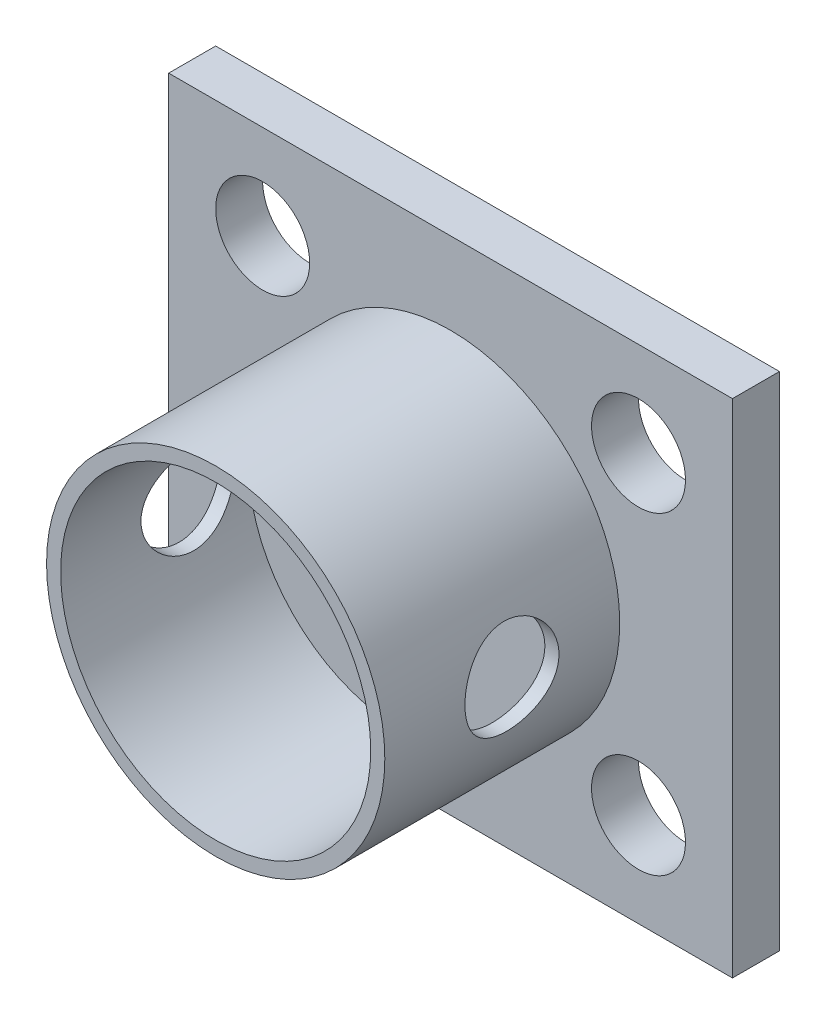
ISO-10303-21;
HEADER;
FILE_DESCRIPTION(('STEP AP214'),'2;1');
FILE_NAME('part.step','',(''),(''),'','','');
FILE_SCHEMA(('AUTOMOTIVE_DESIGN { 1 0 10303 214 1 1 1 1 }'));
ENDSEC;
DATA;
#1=APPLICATION_CONTEXT('core data for automotive mechanical design processes');
#2=APPLICATION_PROTOCOL_DEFINITION('international standard','automotive_design',2000,#1);
#3=PRODUCT_CONTEXT('',#1,'mechanical');
#4=PRODUCT('Part','Part','',(#3));
#5=PRODUCT_RELATED_PRODUCT_CATEGORY('part','',(#4));
#6=PRODUCT_DEFINITION_FORMATION('','',#4);
#7=PRODUCT_DEFINITION_CONTEXT('part definition',#1,'design');
#8=PRODUCT_DEFINITION('design','',#6,#7);
#9=PRODUCT_DEFINITION_SHAPE('','',#8);
#10=(LENGTH_UNIT() NAMED_UNIT(*) SI_UNIT(.MILLI.,.METRE.));
#11=(NAMED_UNIT(*) PLANE_ANGLE_UNIT() SI_UNIT($,.RADIAN.));
#12=(NAMED_UNIT(*) SI_UNIT($,.STERADIAN.) SOLID_ANGLE_UNIT());
#13=UNCERTAINTY_MEASURE_WITH_UNIT(LENGTH_MEASURE(1.E-05),#10,'distance_accuracy_value','');
#14=(GEOMETRIC_REPRESENTATION_CONTEXT(3) GLOBAL_UNCERTAINTY_ASSIGNED_CONTEXT((#13)) GLOBAL_UNIT_ASSIGNED_CONTEXT((#10,
#11,#12)) REPRESENTATION_CONTEXT('',''));
#15=CARTESIAN_POINT('',(0.,0.,0.));
#16=DIRECTION('',(0.,0.,1.));
#17=DIRECTION('',(1.,0.,0.));
#18=AXIS2_PLACEMENT_3D('',#15,#16,#17);
#19=CARTESIAN_POINT('',(30.,0.,5.));
#20=DIRECTION('',(1.,0.,0.));
#21=DIRECTION('',(0.,0.,-1.));
#22=AXIS2_PLACEMENT_3D('',#19,#20,#21);
#23=PLANE('',#22);
#24=DIRECTION('',(0.,-1.,0.));
#25=VECTOR('',#24,1.);
#26=CARTESIAN_POINT('',(30.,0.,0.));
#27=LINE('',#26,#25);
#28=CARTESIAN_POINT('',(30.,26.7,0.));
#29=VERTEX_POINT('',#28);
#30=CARTESIAN_POINT('',(30.,-26.7,0.));
#31=VERTEX_POINT('',#30);
#32=EDGE_CURVE('E140',#29,#31,#27,.T.);
#33=ORIENTED_EDGE('',*,*,#32,.F.);
#34=DIRECTION('',(0.,0.,-1.));
#35=VECTOR('',#34,1.);
#36=CARTESIAN_POINT('',(30.,26.7,5.));
#37=LINE('',#36,#35);
#38=CARTESIAN_POINT('',(30.,26.7,5.));
#39=VERTEX_POINT('',#38);
#40=EDGE_CURVE('E55',#39,#29,#37,.T.);
#41=ORIENTED_EDGE('',*,*,#40,.F.);
#42=DIRECTION('',(0.,-1.,0.));
#43=VECTOR('',#42,1.);
#44=CARTESIAN_POINT('',(30.,0.,5.));
#45=LINE('',#44,#43);
#46=CARTESIAN_POINT('',(30.,-26.7,5.));
#47=VERTEX_POINT('',#46);
#48=EDGE_CURVE('E113',#39,#47,#45,.T.);
#49=ORIENTED_EDGE('',*,*,#48,.T.);
#50=DIRECTION('',(0.,0.,-1.));
#51=VECTOR('',#50,1.);
#52=CARTESIAN_POINT('',(30.,-26.7,5.));
#53=LINE('',#52,#51);
#54=EDGE_CURVE('E88',#47,#31,#53,.T.);
#55=ORIENTED_EDGE('',*,*,#54,.T.);
#56=EDGE_LOOP('',(#33,#41,#49,#55));
#57=FACE_BOUND('',#56,.T.);
#58=ADVANCED_FACE('F39',(#57),#23,.T.);
#59=CARTESIAN_POINT('',(0.,26.7,5.));
#60=DIRECTION('',(0.,1.,0.));
#61=DIRECTION('',(0.,0.,1.));
#62=AXIS2_PLACEMENT_3D('',#59,#60,#61);
#63=PLANE('',#62);
#64=DIRECTION('',(1.,0.,0.));
#65=VECTOR('',#64,1.);
#66=CARTESIAN_POINT('',(0.,26.7,0.));
#67=LINE('',#66,#65);
#68=CARTESIAN_POINT('',(-30.,26.7,0.));
#69=VERTEX_POINT('',#68);
#70=EDGE_CURVE('E101',#69,#29,#67,.T.);
#71=ORIENTED_EDGE('',*,*,#70,.F.);
#72=DIRECTION('',(0.,0.,-1.));
#73=VECTOR('',#72,1.);
#74=CARTESIAN_POINT('',(-30.,26.7,5.));
#75=LINE('',#74,#73);
#76=CARTESIAN_POINT('',(-30.,26.7,5.));
#77=VERTEX_POINT('',#76);
#78=EDGE_CURVE('E95',#77,#69,#75,.T.);
#79=ORIENTED_EDGE('',*,*,#78,.F.);
#80=DIRECTION('',(1.,0.,0.));
#81=VECTOR('',#80,1.);
#82=CARTESIAN_POINT('',(0.,26.7,5.));
#83=LINE('',#82,#81);
#84=EDGE_CURVE('E99',#77,#39,#83,.T.);
#85=ORIENTED_EDGE('',*,*,#84,.T.);
#86=ORIENTED_EDGE('',*,*,#40,.T.);
#87=EDGE_LOOP('',(#71,#79,#85,#86));
#88=FACE_BOUND('',#87,.T.);
#89=ADVANCED_FACE('F97',(#88),#63,.T.);
#90=CARTESIAN_POINT('',(-30.,0.,5.));
#91=DIRECTION('',(1.,0.,0.));
#92=DIRECTION('',(0.,0.,-1.));
#93=AXIS2_PLACEMENT_3D('',#90,#91,#92);
#94=PLANE('',#93);
#95=DIRECTION('',(0.,-1.,0.));
#96=VECTOR('',#95,1.);
#97=CARTESIAN_POINT('',(-30.,0.,0.));
#98=LINE('',#97,#96);
#99=CARTESIAN_POINT('',(-30.,-26.7,0.));
#100=VERTEX_POINT('',#99);
#101=EDGE_CURVE('E145',#69,#100,#98,.T.);
#102=ORIENTED_EDGE('',*,*,#101,.T.);
#103=DIRECTION('',(0.,0.,-1.));
#104=VECTOR('',#103,1.);
#105=CARTESIAN_POINT('',(-30.,-26.7,5.));
#106=LINE('',#105,#104);
#107=CARTESIAN_POINT('',(-30.,-26.7,5.));
#108=VERTEX_POINT('',#107);
#109=EDGE_CURVE('E105',#108,#100,#106,.T.);
#110=ORIENTED_EDGE('',*,*,#109,.F.);
#111=DIRECTION('',(0.,-1.,0.));
#112=VECTOR('',#111,1.);
#113=CARTESIAN_POINT('',(-30.,0.,5.));
#114=LINE('',#113,#112);
#115=EDGE_CURVE('E108',#77,#108,#114,.T.);
#116=ORIENTED_EDGE('',*,*,#115,.F.);
#117=ORIENTED_EDGE('',*,*,#78,.T.);
#118=EDGE_LOOP('',(#102,#110,#116,#117));
#119=FACE_BOUND('',#118,.T.);
#120=ADVANCED_FACE('F109',(#119),#94,.F.);
#121=CARTESIAN_POINT('',(-20.,16.7,5.));
#122=DIRECTION('',(0.,0.,-1.));
#123=DIRECTION('',(-1.,0.,0.));
#124=AXIS2_PLACEMENT_3D('',#121,#122,#123);
#125=CYLINDRICAL_SURFACE('',#124,5.);
#126=CARTESIAN_POINT('',(-20.,16.7,5.));
#127=DIRECTION('',(0.,0.,1.));
#128=DIRECTION('',(1.,0.,0.));
#129=AXIS2_PLACEMENT_3D('',#126,#127,#128);
#130=CIRCLE('',#129,5.);
#131=CARTESIAN_POINT('',(-15.,16.7,5.));
#132=VERTEX_POINT('',#131);
#133=EDGE_CURVE('E272',#132,#132,#130,.T.);
#134=ORIENTED_EDGE('',*,*,#133,.T.);
#135=EDGE_LOOP('',(#134));
#136=FACE_BOUND('',#135,.T.);
#137=CARTESIAN_POINT('',(-20.,16.7,0.));
#138=DIRECTION('',(0.,0.,1.));
#139=DIRECTION('',(1.,0.,0.));
#140=AXIS2_PLACEMENT_3D('',#137,#138,#139);
#141=CIRCLE('',#140,5.);
#142=CARTESIAN_POINT('',(-15.,16.7,0.));
#143=VERTEX_POINT('',#142);
#144=EDGE_CURVE('E136',#143,#143,#141,.T.);
#145=ORIENTED_EDGE('',*,*,#144,.F.);
#146=EDGE_LOOP('',(#145));
#147=FACE_BOUND('',#146,.T.);
#148=ADVANCED_FACE('F209',(#136,#147),#125,.F.);
#149=CARTESIAN_POINT('',(20.,16.7,5.));
#150=DIRECTION('',(0.,0.,-1.));
#151=DIRECTION('',(-1.,0.,0.));
#152=AXIS2_PLACEMENT_3D('',#149,#150,#151);
#153=CYLINDRICAL_SURFACE('',#152,5.);
#154=CARTESIAN_POINT('',(20.,16.7,5.));
#155=DIRECTION('',(0.,0.,1.));
#156=DIRECTION('',(1.,0.,0.));
#157=AXIS2_PLACEMENT_3D('',#154,#155,#156);
#158=CIRCLE('',#157,5.);
#159=CARTESIAN_POINT('',(25.,16.7,5.));
#160=VERTEX_POINT('',#159);
#161=EDGE_CURVE('E268',#160,#160,#158,.T.);
#162=ORIENTED_EDGE('',*,*,#161,.T.);
#163=EDGE_LOOP('',(#162));
#164=FACE_BOUND('',#163,.T.);
#165=CARTESIAN_POINT('',(20.,16.7,0.));
#166=DIRECTION('',(0.,0.,1.));
#167=DIRECTION('',(1.,0.,0.));
#168=AXIS2_PLACEMENT_3D('',#165,#166,#167);
#169=CIRCLE('',#168,5.);
#170=CARTESIAN_POINT('',(25.,16.7,0.));
#171=VERTEX_POINT('',#170);
#172=EDGE_CURVE('E132',#171,#171,#169,.T.);
#173=ORIENTED_EDGE('',*,*,#172,.F.);
#174=EDGE_LOOP('',(#173));
#175=FACE_BOUND('',#174,.T.);
#176=ADVANCED_FACE('F216',(#164,#175),#153,.F.);
#177=CARTESIAN_POINT('',(20.,-16.7,5.));
#178=DIRECTION('',(0.,0.,-1.));
#179=DIRECTION('',(-1.,0.,0.));
#180=AXIS2_PLACEMENT_3D('',#177,#178,#179);
#181=CYLINDRICAL_SURFACE('',#180,5.);
#182=CARTESIAN_POINT('',(20.,-16.7,5.));
#183=DIRECTION('',(0.,0.,1.));
#184=DIRECTION('',(1.,0.,0.));
#185=AXIS2_PLACEMENT_3D('',#182,#183,#184);
#186=CIRCLE('',#185,5.);
#187=CARTESIAN_POINT('',(25.,-16.7,5.));
#188=VERTEX_POINT('',#187);
#189=EDGE_CURVE('E230',#188,#188,#186,.T.);
#190=ORIENTED_EDGE('',*,*,#189,.T.);
#191=EDGE_LOOP('',(#190));
#192=FACE_BOUND('',#191,.T.);
#193=CARTESIAN_POINT('',(20.,-16.7,0.));
#194=DIRECTION('',(0.,0.,1.));
#195=DIRECTION('',(1.,0.,0.));
#196=AXIS2_PLACEMENT_3D('',#193,#194,#195);
#197=CIRCLE('',#196,5.);
#198=CARTESIAN_POINT('',(25.,-16.7,0.));
#199=VERTEX_POINT('',#198);
#200=EDGE_CURVE('E127',#199,#199,#197,.T.);
#201=ORIENTED_EDGE('',*,*,#200,.F.);
#202=EDGE_LOOP('',(#201));
#203=FACE_BOUND('',#202,.T.);
#204=ADVANCED_FACE('F219',(#192,#203),#181,.F.);
#205=CARTESIAN_POINT('',(-20.,-16.7,5.));
#206=DIRECTION('',(0.,0.,-1.));
#207=DIRECTION('',(-1.,0.,0.));
#208=AXIS2_PLACEMENT_3D('',#205,#206,#207);
#209=CYLINDRICAL_SURFACE('',#208,5.);
#210=CARTESIAN_POINT('',(-20.,-16.7,5.));
#211=DIRECTION('',(0.,0.,1.));
#212=DIRECTION('',(1.,0.,0.));
#213=AXIS2_PLACEMENT_3D('',#210,#211,#212);
#214=CIRCLE('',#213,5.);
#215=CARTESIAN_POINT('',(-15.,-16.7,5.));
#216=VERTEX_POINT('',#215);
#217=EDGE_CURVE('E150',#216,#216,#214,.T.);
#218=ORIENTED_EDGE('',*,*,#217,.T.);
#219=EDGE_LOOP('',(#218));
#220=FACE_BOUND('',#219,.T.);
#221=CARTESIAN_POINT('',(-20.,-16.7,0.));
#222=DIRECTION('',(0.,0.,1.));
#223=DIRECTION('',(1.,0.,0.));
#224=AXIS2_PLACEMENT_3D('',#221,#222,#223);
#225=CIRCLE('',#224,5.);
#226=CARTESIAN_POINT('',(-15.,-16.7,0.));
#227=VERTEX_POINT('',#226);
#228=EDGE_CURVE('E123',#227,#227,#225,.T.);
#229=ORIENTED_EDGE('',*,*,#228,.F.);
#230=EDGE_LOOP('',(#229));
#231=FACE_BOUND('',#230,.T.);
#232=ADVANCED_FACE('F41',(#220,#231),#209,.F.);
#233=CARTESIAN_POINT('',(0.,-26.7,5.));
#234=DIRECTION('',(0.,1.,0.));
#235=DIRECTION('',(0.,0.,1.));
#236=AXIS2_PLACEMENT_3D('',#233,#234,#235);
#237=PLANE('',#236);
#238=DIRECTION('',(1.,0.,0.));
#239=VECTOR('',#238,1.);
#240=CARTESIAN_POINT('',(0.,-26.7,0.));
#241=LINE('',#240,#239);
#242=EDGE_CURVE('E81',#100,#31,#241,.T.);
#243=ORIENTED_EDGE('',*,*,#242,.T.);
#244=ORIENTED_EDGE('',*,*,#54,.F.);
#245=DIRECTION('',(1.,0.,0.));
#246=VECTOR('',#245,1.);
#247=CARTESIAN_POINT('',(0.,-26.7,5.));
#248=LINE('',#247,#246);
#249=EDGE_CURVE('E64',#108,#47,#248,.T.);
#250=ORIENTED_EDGE('',*,*,#249,.F.);
#251=ORIENTED_EDGE('',*,*,#109,.T.);
#252=EDGE_LOOP('',(#243,#244,#250,#251));
#253=FACE_BOUND('',#252,.T.);
#254=ADVANCED_FACE('F199',(#253),#237,.F.);
#255=CARTESIAN_POINT('',(0.,0.,5.));
#256=DIRECTION('',(0.,0.,1.));
#257=DIRECTION('',(1.,0.,0.));
#258=AXIS2_PLACEMENT_3D('',#255,#256,#257);
#259=PLANE('',#258);
#260=ORIENTED_EDGE('',*,*,#217,.F.);
#261=EDGE_LOOP('',(#260));
#262=FACE_BOUND('',#261,.T.);
#263=ORIENTED_EDGE('',*,*,#189,.F.);
#264=EDGE_LOOP('',(#263));
#265=FACE_BOUND('',#264,.T.);
#266=ORIENTED_EDGE('',*,*,#161,.F.);
#267=EDGE_LOOP('',(#266));
#268=FACE_BOUND('',#267,.T.);
#269=ORIENTED_EDGE('',*,*,#133,.F.);
#270=EDGE_LOOP('',(#269));
#271=FACE_BOUND('',#270,.T.);
#272=CARTESIAN_POINT('',(0.,0.,5.));
#273=DIRECTION('',(0.,0.,1.));
#274=DIRECTION('',(1.,0.,0.));
#275=AXIS2_PLACEMENT_3D('',#272,#273,#274);
#276=CIRCLE('',#275,18.);
#277=CARTESIAN_POINT('',(18.,0.,5.));
#278=VERTEX_POINT('',#277);
#279=EDGE_CURVE('E117',#278,#278,#276,.T.);
#280=ORIENTED_EDGE('',*,*,#279,.F.);
#281=EDGE_LOOP('',(#280));
#282=FACE_BOUND('',#281,.T.);
#283=ORIENTED_EDGE('',*,*,#48,.F.);
#284=ORIENTED_EDGE('',*,*,#84,.F.);
#285=ORIENTED_EDGE('',*,*,#115,.T.);
#286=ORIENTED_EDGE('',*,*,#249,.T.);
#287=EDGE_LOOP('',(#283,#284,#285,#286));
#288=FACE_BOUND('',#287,.T.);
#289=ADVANCED_FACE('F112',(#262,#265,#268,#271,#282,#288),#259,.T.);
#290=CARTESIAN_POINT('',(0.,0.,0.));
#291=DIRECTION('',(0.,0.,1.));
#292=DIRECTION('',(1.,0.,0.));
#293=AXIS2_PLACEMENT_3D('',#290,#291,#292);
#294=PLANE('',#293);
#295=ORIENTED_EDGE('',*,*,#228,.T.);
#296=EDGE_LOOP('',(#295));
#297=FACE_BOUND('',#296,.T.);
#298=ORIENTED_EDGE('',*,*,#200,.T.);
#299=EDGE_LOOP('',(#298));
#300=FACE_BOUND('',#299,.T.);
#301=ORIENTED_EDGE('',*,*,#172,.T.);
#302=EDGE_LOOP('',(#301));
#303=FACE_BOUND('',#302,.T.);
#304=ORIENTED_EDGE('',*,*,#144,.T.);
#305=EDGE_LOOP('',(#304));
#306=FACE_BOUND('',#305,.T.);
#307=ORIENTED_EDGE('',*,*,#32,.T.);
#308=ORIENTED_EDGE('',*,*,#242,.F.);
#309=ORIENTED_EDGE('',*,*,#101,.F.);
#310=ORIENTED_EDGE('',*,*,#70,.T.);
#311=EDGE_LOOP('',(#307,#308,#309,#310));
#312=FACE_BOUND('',#311,.T.);
#313=CARTESIAN_POINT('',(7.5,0.,0.));
#314=DIRECTION('',(0.,0.,1.));
#315=DIRECTION('',(1.,0.,0.));
#316=AXIS2_PLACEMENT_3D('',#313,#314,#315);
#317=CIRCLE('',#316,2.5);
#318=CARTESIAN_POINT('',(10.,0.,0.));
#319=VERTEX_POINT('',#318);
#320=EDGE_CURVE('E241',#319,#319,#317,.T.);
#321=ORIENTED_EDGE('',*,*,#320,.T.);
#322=EDGE_LOOP('',(#321));
#323=FACE_BOUND('',#322,.T.);
#324=CARTESIAN_POINT('',(-7.5,0.,0.));
#325=DIRECTION('',(0.,0.,1.));
#326=DIRECTION('',(1.,0.,0.));
#327=AXIS2_PLACEMENT_3D('',#324,#325,#326);
#328=CIRCLE('',#327,2.5);
#329=CARTESIAN_POINT('',(-5.,0.,0.));
#330=VERTEX_POINT('',#329);
#331=EDGE_CURVE('E244',#330,#330,#328,.T.);
#332=ORIENTED_EDGE('',*,*,#331,.T.);
#333=EDGE_LOOP('',(#332));
#334=FACE_BOUND('',#333,.T.);
#335=ADVANCED_FACE('F194',(#297,#300,#303,#306,#312,#323,#334),#294,.F.);
#336=CARTESIAN_POINT('',(0.,0.,30.));
#337=DIRECTION('',(0.,0.,-1.));
#338=DIRECTION('',(-1.,0.,0.));
#339=AXIS2_PLACEMENT_3D('',#336,#337,#338);
#340=CYLINDRICAL_SURFACE('',#339,16.5);
#341=CARTESIAN_POINT('',(-16.5,0.,21.4371579635405));
#342=CARTESIAN_POINT('',(-16.4999979772443,-0.273995109088189,21.4105808688592));
#343=CARTESIAN_POINT('',(-16.4931110496491,-0.545822084118837,21.3613042945535));
#344=CARTESIAN_POINT('',(-16.4669544682069,-1.07716317762142,21.2189379691184));
#345=CARTESIAN_POINT('',(-16.4476804335706,-1.33667290512952,21.1258327207818));
#346=CARTESIAN_POINT('',(-16.3994757211301,-1.83576030963072,20.8989698143456));
#347=CARTESIAN_POINT('',(-16.3705599155458,-2.07536797845766,20.7652747933304));
#348=CARTESIAN_POINT('',(-16.3066446763111,-2.52901038183084,20.4610616542238));
#349=CARTESIAN_POINT('',(-16.2716445306011,-2.74304211823437,20.2905392255984));
#350=CARTESIAN_POINT('',(-16.1987493654942,-3.1453829339529,19.9123771872455));
#351=CARTESIAN_POINT('',(-16.160803388273,-3.33290028704453,19.7039045929965));
#352=CARTESIAN_POINT('',(-16.0874417319175,-3.67071925531667,19.2582878754018));
#353=CARTESIAN_POINT('',(-16.0520262611487,-3.82101780835552,19.0211413953265));
#354=CARTESIAN_POINT('',(-15.9877345733757,-4.08174945616587,18.5212183781881));
#355=CARTESIAN_POINT('',(-15.9589438328803,-4.19167131497604,18.2581633095807));
#356=CARTESIAN_POINT('',(-15.9123044412418,-4.36540373440811,17.7163336222346));
#357=CARTESIAN_POINT('',(-15.8944529678644,-4.42922618902951,17.4375630782339));
#358=CARTESIAN_POINT('',(-15.8724975498813,-4.50726392165206,16.881296266816));
#359=CARTESIAN_POINT('',(-15.8679920146583,-4.52292886560486,16.6040190922566));
#360=CARTESIAN_POINT('',(-15.872184712595,-4.50819406137103,16.0508150039084));
#361=CARTESIAN_POINT('',(-15.8808814642927,-4.47779948164108,15.7748879421054));
#362=CARTESIAN_POINT('',(-15.9100008204438,-4.37317831548921,15.2382362867359));
#363=CARTESIAN_POINT('',(-15.9301722246276,-4.29988979142017,14.9773137922218));
#364=CARTESIAN_POINT('',(-15.9795473532105,-4.11258882862157,14.4714380518706));
#365=CARTESIAN_POINT('',(-16.0087524255241,-3.99857031217148,14.226487195772));
#366=CARTESIAN_POINT('',(-16.0735109052997,-3.72984395408786,13.7529942443876));
#367=CARTESIAN_POINT('',(-16.1092005046729,-3.57422058560905,13.5249907822123));
#368=CARTESIAN_POINT('',(-16.1821703654329,-3.22779141917444,13.0977469376796));
#369=CARTESIAN_POINT('',(-16.2194509408162,-3.03697865129491,12.8985122674871));
#370=CARTESIAN_POINT('',(-16.2922608194836,-2.61887059505213,12.5285086467785));
#371=CARTESIAN_POINT('',(-16.3277071761922,-2.39067256644436,12.3587410006038));
#372=CARTESIAN_POINT('',(-16.3911100264845,-1.90804827772265,12.0599407454073));
#373=CARTESIAN_POINT('',(-16.4190673154067,-1.65362480672683,11.930903810526));
#374=CARTESIAN_POINT('',(-16.4633766512477,-1.12934018598848,11.7191776373798));
#375=CARTESIAN_POINT('',(-16.4798850622076,-0.859743719033432,11.6358673092391));
#376=CARTESIAN_POINT('',(-16.4993788821155,-0.309935619350493,11.5157233540645));
#377=CARTESIAN_POINT('',(-16.502367827598,-0.0297267820369846,11.4788775742658));
#378=CARTESIAN_POINT('',(-16.4939523870451,0.522625059006004,11.4533019522521));
#379=CARTESIAN_POINT('',(-16.483056352626,0.794700301197959,11.4629067229962));
#380=CARTESIAN_POINT('',(-16.4482883445308,1.3328655472473,11.5258805260271));
#381=CARTESIAN_POINT('',(-16.4244164533231,1.59895558913263,11.5792492801717));
#382=CARTESIAN_POINT('',(-16.3656469876219,2.11745928228842,11.7276361985421));
#383=CARTESIAN_POINT('',(-16.3307667331539,2.36989369275843,11.8225890267572));
#384=CARTESIAN_POINT('',(-16.2529336835751,2.85528259036513,12.0511236578919));
#385=CARTESIAN_POINT('',(-16.2099791920996,3.08823296909733,12.1847135814921));
#386=CARTESIAN_POINT('',(-16.1179524189622,3.53784572425456,12.4927571637715));
#387=CARTESIAN_POINT('',(-16.0687068354146,3.75351802978466,12.6686017783166));
#388=CARTESIAN_POINT('',(-15.9701520515461,4.15290475511814,13.053716587293));
#389=CARTESIAN_POINT('',(-15.9208428384154,4.33661118555463,13.262995113006));
#390=CARTESIAN_POINT('',(-15.8498927416776,4.58679965258056,13.6010388054832));
#391=CARTESIAN_POINT('',(-15.8264390217665,4.66690035682889,13.7195795919282));
#392=CARTESIAN_POINT('',(-15.7814663816223,4.81678647997246,13.9633418184085));
#393=CARTESIAN_POINT('',(-15.7599467070189,4.88657592765095,14.0885606230639));
#394=CARTESIAN_POINT('',(-15.7194584365775,5.01529520262988,14.3448861533887));
#395=CARTESIAN_POINT('',(-15.7004904117959,5.07422260010475,14.4759941883327));
#396=CARTESIAN_POINT('',(-15.6656902637135,5.18066451939995,14.743106102423));
#397=CARTESIAN_POINT('',(-15.6498567275569,5.22818418526515,14.8791077429812));
#398=CARTESIAN_POINT('',(-15.6222184050946,5.31018942698835,15.1510760911257));
#399=CARTESIAN_POINT('',(-15.6103107544454,5.34501086855544,15.2869310763414));
#400=CARTESIAN_POINT('',(-15.5902853888573,5.40314247541574,15.5613016577228));
#401=CARTESIAN_POINT('',(-15.5821660837986,5.4264574706615,15.6998161121386));
#402=CARTESIAN_POINT('',(-15.5699683783816,5.46135766599501,15.9784783349035));
#403=CARTESIAN_POINT('',(-15.5658895663345,5.47294406112079,16.1186259353776));
#404=CARTESIAN_POINT('',(-15.5619033658487,5.48426850292335,16.3994563268541));
#405=CARTESIAN_POINT('',(-15.5619958329986,5.48400695978074,16.5401390991599));
#406=CARTESIAN_POINT('',(-15.5662415791229,5.47194284278258,16.8140508677873));
#407=CARTESIAN_POINT('',(-15.5701962406025,5.46070474680965,16.9473082261264));
#408=CARTESIAN_POINT('',(-15.5817612168312,5.42761682145708,17.2123839301021));
#409=CARTESIAN_POINT('',(-15.5893727636256,5.40576341563408,17.3442017754319));
#410=CARTESIAN_POINT('',(-15.6080306134555,5.35165367812518,17.6053884813387));
#411=CARTESIAN_POINT('',(-15.6190757840182,5.31940077625572,17.7347581344721));
#412=CARTESIAN_POINT('',(-15.6442971008179,5.24476108664483,17.9902750523574));
#413=CARTESIAN_POINT('',(-15.658474435121,5.2023704530392,18.1164210740375));
#414=CARTESIAN_POINT('',(-15.6896607966832,5.10754795278928,18.3653189091685));
#415=CARTESIAN_POINT('',(-15.7066847663022,5.05506286836296,18.4880486006216));
#416=CARTESIAN_POINT('',(-15.7430611124838,4.94061040361676,18.7286616343615));
#417=CARTESIAN_POINT('',(-15.7624143286735,4.87863960176463,18.8465432083717));
#418=CARTESIAN_POINT('',(-15.8232380346589,4.67915320045219,19.1918164774387));
#419=CARTESIAN_POINT('',(-15.8674973042623,4.52799149301614,19.4110249366705));
#420=CARTESIAN_POINT('',(-15.9615368949461,4.18479523286952,19.832743188336));
#421=CARTESIAN_POINT('',(-16.0114836244016,3.99107052027929,20.0338330027808));
#422=CARTESIAN_POINT('',(-16.110006880894,3.57264865014367,20.4012595499425));
#423=CARTESIAN_POINT('',(-16.1585830773523,3.34794409577546,20.5675879590086));
#424=CARTESIAN_POINT('',(-16.2508330686995,2.86734150489234,20.8644850576752));
#425=CARTESIAN_POINT('',(-16.2943612121689,2.6108242154389,20.9940996248387));
#426=CARTESIAN_POINT('',(-16.3708233978129,2.07806847180058,21.2078190391444));
#427=CARTESIAN_POINT('',(-16.4037633364908,1.80184109914077,21.2919492341061));
#428=CARTESIAN_POINT('',(-16.4528449796211,1.27133190593663,21.4044551236214));
#429=CARTESIAN_POINT('',(-16.4705154975204,1.01833213861391,21.4382594308468));
#430=CARTESIAN_POINT('',(-16.4940931109489,0.50960087713761,21.4669205742453));
#431=CARTESIAN_POINT('',(-16.5000018741814,0.253869775431268,21.4617829325073));
#432=CARTESIAN_POINT('',(-16.5,0.,21.4371579635405));
#433=B_SPLINE_CURVE_WITH_KNOTS('',3,(#341,#342,#343,#344,#345,#346,#347,#348,#349,#350,#351,
#352,#353,#354,#355,#356,#357,#358,#359,#360,#361,#362,#363,#364,#365,#366,#367,#368,#369,#370,
#371,#372,#373,#374,#375,#376,#377,#378,#379,#380,#381,#382,#383,#384,#385,#386,#387,#388,#389,
#390,#391,#392,#393,#394,#395,#396,#397,#398,#399,#400,#401,#402,#403,#404,#405,#406,#407,#408,
#409,#410,#411,#412,#413,#414,#415,#416,#417,#418,#419,#420,#421,#422,#423,#424,#425,#426,#427,
#428,#429,#430,#431,#432),.UNSPECIFIED.,.T.,.F.,(4,2,2,2,2,2,2,2,2,2,2,2,2,2,2,2,2,2,2,2,2,2,2,
2,2,2,2,2,2,2,2,2,2,2,2,2,2,2,2,2,2,2,2,2,2,4),(0.,0.824899232784821,1.65009035775548,
2.47401448662374,3.29803510557566,4.1429922882312,4.98801896586211,5.84340362210716,
6.69856750364795,7.52772337012974,8.35678620180532,9.16836177946925,9.98005851088467,
10.811343364423,11.6427930467774,12.4985258259758,13.3541676903279,14.1978803477848,
15.0413722870849,15.8548515521623,16.6683256472063,17.4805261889577,18.292897561879,
19.136963706554,19.9812405101907,20.4157274500798,20.8500441770364,21.2844579424479,
21.718675449812,22.1403917675532,22.5619309145265,22.9834271061579,23.4049087054255,
23.8057982172447,24.2068228880127,24.6077154334801,25.008760304033,25.4119804945762,
25.8153464723228,26.6214762532447,27.4686811782733,28.3160887354671,29.1838357014071,
30.0510985840331,30.8155161800628,31.5798253813381),.UNSPECIFIED.);
#434=CARTESIAN_POINT('',(-16.5,0.,21.4371579635405));
#435=VERTEX_POINT('',#434);
#436=EDGE_CURVE('E185',#435,#435,#433,.T.);
#437=ORIENTED_EDGE('',*,*,#436,.F.);
#438=EDGE_LOOP('',(#437));
#439=FACE_BOUND('',#438,.T.);
#440=CARTESIAN_POINT('',(16.4929388737292,0.482666870037542,11.4605092224128));
#441=CARTESIAN_POINT('',(16.5009218938571,0.209840688000823,11.4605111076742));
#442=CARTESIAN_POINT('',(16.5020749452906,-0.063206690896577,11.4829117274505));
#443=CARTESIAN_POINT('',(16.4912247448818,-0.601756155176245,11.5718950304355));
#444=CARTESIAN_POINT('',(16.4792189473176,-0.867256770359114,11.6384862618131));
#445=CARTESIAN_POINT('',(16.4439800104263,-1.38284774756322,11.8135852044408));
#446=CARTESIAN_POINT('',(16.4207608307774,-1.63295683537415,11.9220407646638));
#447=CARTESIAN_POINT('',(16.3661017556573,-2.11159143792604,12.1775825847176));
#448=CARTESIAN_POINT('',(16.3346606795981,-2.34011384660055,12.3246743923681));
#449=CARTESIAN_POINT('',(16.266524131407,-2.77484224336849,12.6571933935338));
#450=CARTESIAN_POINT('',(16.2297257349946,-2.98042516749458,12.8434137710142));
#451=CARTESIAN_POINT('',(16.155822159942,-3.35805158777165,13.2472055452993));
#452=CARTESIAN_POINT('',(16.1187169320591,-3.53008958704413,13.4647820701741));
#453=CARTESIAN_POINT('',(16.0477601557845,-3.83996950444376,13.9316302552695));
#454=CARTESIAN_POINT('',(16.0140130282878,-3.97684993391668,14.1815578525979));
#455=CARTESIAN_POINT('',(15.9552404527707,-4.20647652581788,14.7018850125666));
#456=CARTESIAN_POINT('',(15.9302134745787,-4.29923043240986,14.9722809733661));
#457=CARTESIAN_POINT('',(15.8926533847571,-4.43605117915038,15.5201379709729));
#458=CARTESIAN_POINT('',(15.8798775464263,-4.48106585259988,15.7973450787493));
#459=CARTESIAN_POINT('',(15.8676836526754,-4.5240636797097,16.3556485306158));
#460=CARTESIAN_POINT('',(15.8682628054024,-4.52205666322471,16.6367440495566));
#461=CARTESIAN_POINT('',(15.8824629805748,-4.47190889511319,17.1856235654596));
#462=CARTESIAN_POINT('',(15.8956801022844,-4.42519684430809,17.4535503855334));
#463=CARTESIAN_POINT('',(15.9328839507795,-4.28930315919015,17.9776112224852));
#464=CARTESIAN_POINT('',(15.9568716421337,-4.20011772108854,18.2337441808867));
#465=CARTESIAN_POINT('',(16.0129993627437,-3.98079591562577,18.7303137746894));
#466=CARTESIAN_POINT('',(16.0452280147454,-3.85021041978631,18.9705415649719));
#467=CARTESIAN_POINT('',(16.1138537043353,-3.55205024674764,19.4261835794533));
#468=CARTESIAN_POINT('',(16.1502516337083,-3.38446764894433,19.6415924751944));
#469=CARTESIAN_POINT('',(16.2242573739953,-3.01015533395801,20.0492948200463));
#470=CARTESIAN_POINT('',(16.2618635149375,-2.80227264039596,20.2405318246548));
#471=CARTESIAN_POINT('',(16.3323703065733,-2.35678944454419,20.5856606080385));
#472=CARTESIAN_POINT('',(16.3652708843558,-2.11918848188773,20.7395518081802));
#473=CARTESIAN_POINT('',(16.4221659863696,-1.62032797738372,21.005546453907));
#474=CARTESIAN_POINT('',(16.4461524253957,-1.35904722357895,21.1176119636029));
#475=CARTESIAN_POINT('',(16.4817907149287,-0.82053086268258,21.2960104249401));
#476=CARTESIAN_POINT('',(16.4934459580213,-0.543299666054908,21.3623559534109));
#477=CARTESIAN_POINT('',(16.5022254696998,0.00873149165307171,21.4455423170205));
#478=CARTESIAN_POINT('',(16.4998460608034,0.283274436187674,21.4640411369134));
#479=CARTESIAN_POINT('',(16.4813297255267,0.83119573171948,21.4558651625091));
#480=CARTESIAN_POINT('',(16.4651940926508,1.10457418978499,21.4291946152763));
#481=CARTESIAN_POINT('',(16.4206515395745,1.63790162541026,21.3326461686135));
#482=CARTESIAN_POINT('',(16.3924470017765,1.89799618315798,21.2634729986249));
#483=CARTESIAN_POINT('',(16.3261169135856,2.40265206344748,21.0849351776126));
#484=CARTESIAN_POINT('',(16.2879898534727,2.6472110151834,20.9755644094464));
#485=CARTESIAN_POINT('',(16.2038136488199,3.12191020388405,20.7160693301721));
#486=CARTESIAN_POINT('',(16.157561250405,3.35139826314111,20.5648214186909));
#487=CARTESIAN_POINT('',(16.0621498020264,3.7823398679598,20.2270792659398));
#488=CARTESIAN_POINT('',(16.0129899313238,3.98378544317817,20.0405750393553));
#489=CARTESIAN_POINT('',(15.9396511773308,4.26467198883886,19.7341472766583));
#490=CARTESIAN_POINT('',(15.9148120745043,4.35624854519525,19.6252569478984));
#491=CARTESIAN_POINT('',(15.8662592301185,4.52989272890714,19.3999246688277));
#492=CARTESIAN_POINT('',(15.8425450801223,4.61196382325787,19.2834854961841));
#493=CARTESIAN_POINT('',(15.7968788827315,4.76603443419819,19.0437400966199));
#494=CARTESIAN_POINT('',(15.7749275022019,4.83803014679511,18.9204313004845));
#495=CARTESIAN_POINT('',(15.733428313841,4.97132833231926,18.6678375578708));
#496=CARTESIAN_POINT('',(15.7138794781406,5.0326353828573,18.5385551998347));
#497=CARTESIAN_POINT('',(15.6779414769023,5.14349243780886,18.2762113842255));
#498=CARTESIAN_POINT('',(15.6615218506685,5.19315699777995,18.1432025436461));
#499=CARTESIAN_POINT('',(15.6320993969253,5.28106226736365,17.8731504672888));
#500=CARTESIAN_POINT('',(15.6190951500541,5.31930772342916,17.73610893383));
#501=CARTESIAN_POINT('',(15.5969061291933,5.38402185821684,17.4589888829941));
#502=CARTESIAN_POINT('',(15.5877207589565,5.41049237542404,17.3189108433075));
#503=CARTESIAN_POINT('',(15.5734656133982,5.45138885526681,17.0368019125946));
#504=CARTESIAN_POINT('',(15.5683956429274,5.46581538902039,16.8947711144914));
#505=CARTESIAN_POINT('',(15.5626900669411,5.48203842023334,16.6173036586399));
#506=CARTESIAN_POINT('',(15.5618380853164,5.48445124118785,16.4819071094559));
#507=CARTESIAN_POINT('',(15.5640087398432,5.47828835352919,16.2113479075316));
#508=CARTESIAN_POINT('',(15.5670326901315,5.46970891798616,16.0761853496877));
#509=CARTESIAN_POINT('',(15.5768650018608,5.44164464386995,15.8071964979255));
#510=CARTESIAN_POINT('',(15.5836717527129,5.42216444644895,15.6733696599708));
#511=CARTESIAN_POINT('',(15.6008700232091,5.37248025493142,15.4079080339296));
#512=CARTESIAN_POINT('',(15.6112628902169,5.34227223008593,15.2762740892639));
#513=CARTESIAN_POINT('',(15.6351471542639,5.27195688509009,15.0181833627924));
#514=CARTESIAN_POINT('',(15.648587724194,5.23201122130613,14.8916778639467));
#515=CARTESIAN_POINT('',(15.6782869720808,5.14232836058729,14.6425118154295));
#516=CARTESIAN_POINT('',(15.6945466554199,5.09258766958257,14.5198526559722));
#517=CARTESIAN_POINT('',(15.7469283863737,4.92923693969412,14.1588463401499));
#518=CARTESIAN_POINT('',(15.7866733653361,4.80144127717315,13.9272628331785));
#519=CARTESIAN_POINT('',(15.8737725430541,4.50534124223354,13.4782888470449));
#520=CARTESIAN_POINT('',(15.9213837032098,4.33550828262049,13.2619636830042));
#521=CARTESIAN_POINT('',(16.018186324163,3.96291725701554,12.8601015592079));
#522=CARTESIAN_POINT('',(16.0673782677489,3.76014905409022,12.6745741141516));
#523=CARTESIAN_POINT('',(16.1646018071909,3.3179531450035,12.3322685777411));
#524=CARTESIAN_POINT('',(16.2125113215919,3.07739582304983,12.1769112175913));
#525=CARTESIAN_POINT('',(16.3002905038397,2.57218093971078,11.9090708742115));
#526=CARTESIAN_POINT('',(16.3401632059898,2.30753252891905,11.7965716955166));
#527=CARTESIAN_POINT('',(16.4050377297547,1.78543569740751,11.626103200416));
#528=CARTESIAN_POINT('',(16.4310356897992,1.52938454162639,11.5642229080913));
#529=CARTESIAN_POINT('',(16.4711270091292,1.00984560998024,11.4814297155294));
#530=CARTESIAN_POINT('',(16.4852231038777,0.746359557308023,11.4605074002649));
#531=CARTESIAN_POINT('',(16.4929388737292,0.482666870037542,11.4605092224128));
#532=B_SPLINE_CURVE_WITH_KNOTS('',3,(#440,#441,#442,#443,#444,#445,#446,#447,#448,#449,#450,
#451,#452,#453,#454,#455,#456,#457,#458,#459,#460,#461,#462,#463,#464,#465,#466,#467,#468,#469,
#470,#471,#472,#473,#474,#475,#476,#477,#478,#479,#480,#481,#482,#483,#484,#485,#486,#487,#488,
#489,#490,#491,#492,#493,#494,#495,#496,#497,#498,#499,#500,#501,#502,#503,#504,#505,#506,#507,
#508,#509,#510,#511,#512,#513,#514,#515,#516,#517,#518,#519,#520,#521,#522,#523,#524,#525,#526,
#527,#528,#529,#530,#531),.UNSPECIFIED.,.T.,.F.,(4,2,2,2,2,2,2,2,2,2,2,2,2,2,2,2,2,2,2,2,2,2,2,
2,2,2,2,2,2,2,2,2,2,2,2,2,2,2,2,2,2,2,2,2,2,4),(0.,0.817870588867983,1.6358994315896,
2.45291251502035,3.27004297841921,4.10569044832323,4.94147473771321,5.7981353320162,
6.6546455276699,7.49381224770617,8.33280354203353,9.1458472959238,9.95896387726326,
10.7812221335387,11.6036565957424,12.4545207043445,13.3053979953444,14.1570451670731,
15.0084579707802,15.8299461554015,16.6513571036149,17.4595027417187,18.2677714118061,
19.1002746155729,19.9330139556055,20.3658802644554,20.7985881903361,21.2314590482536,
21.6641440636489,22.0923739881802,22.5204256665097,22.9484104873314,23.3763750122332,
23.7821403231268,24.1880432453576,24.593773480077,24.9996563207174,25.3992120338118,
25.7989105349541,26.5976667248642,27.4313941046422,28.2653785801227,29.1322220686269,
29.9987376642706,30.7894098951399,31.5799003525003),.UNSPECIFIED.);
#533=CARTESIAN_POINT('',(16.4929388737292,0.482666870037542,11.4605092224128));
#534=VERTEX_POINT('',#533);
#535=EDGE_CURVE('E179',#534,#534,#532,.T.);
#536=ORIENTED_EDGE('',*,*,#535,.F.);
#537=EDGE_LOOP('',(#536));
#538=FACE_BOUND('',#537,.T.);
#539=CARTESIAN_POINT('',(0.,0.,10.));
#540=DIRECTION('',(0.,0.,1.));
#541=DIRECTION('',(1.,0.,0.));
#542=AXIS2_PLACEMENT_3D('',#539,#540,#541);
#543=CIRCLE('',#542,16.5);
#544=CARTESIAN_POINT('',(16.5,0.,10.));
#545=VERTEX_POINT('',#544);
#546=EDGE_CURVE('E11',#545,#545,#543,.T.);
#547=ORIENTED_EDGE('',*,*,#546,.F.);
#548=EDGE_LOOP('',(#547));
#549=FACE_BOUND('',#548,.T.);
#550=CARTESIAN_POINT('',(0.,0.,30.));
#551=DIRECTION('',(0.,0.,1.));
#552=DIRECTION('',(1.,0.,0.));
#553=AXIS2_PLACEMENT_3D('',#550,#551,#552);
#554=CIRCLE('',#553,16.5);
#555=CARTESIAN_POINT('',(16.5,0.,30.));
#556=VERTEX_POINT('',#555);
#557=EDGE_CURVE('E256',#556,#556,#554,.T.);
#558=ORIENTED_EDGE('',*,*,#557,.T.);
#559=EDGE_LOOP('',(#558));
#560=FACE_BOUND('',#559,.T.);
#561=ADVANCED_FACE('F190',(#439,#538,#549,#560),#340,.F.);
#562=CARTESIAN_POINT('',(0.,0.,30.));
#563=DIRECTION('',(0.,0.,-1.));
#564=DIRECTION('',(-1.,0.,0.));
#565=AXIS2_PLACEMENT_3D('',#562,#563,#564);
#566=CYLINDRICAL_SURFACE('',#565,18.);
#567=CARTESIAN_POINT('',(-18.,0.,21.4371579635405));
#568=CARTESIAN_POINT('',(-17.9999965127438,-0.274860649349454,21.4104943732959));
#569=CARTESIAN_POINT('',(-17.9936438406142,-0.547567750494877,21.3609892545921));
#570=CARTESIAN_POINT('',(-17.9695152363105,-1.08067957959575,21.217841432119));
#571=CARTESIAN_POINT('',(-17.9517337444491,-1.34107825374652,21.1241772525547));
#572=CARTESIAN_POINT('',(-17.9072756394406,-1.8419149874104,20.8958182439455));
#573=CARTESIAN_POINT('',(-17.8806113552761,-2.08238013937539,20.7611803072144));
#574=CARTESIAN_POINT('',(-17.8217202256245,-2.53752458927323,20.4547227812499));
#575=CARTESIAN_POINT('',(-17.7894930084725,-2.75220216268679,20.2829007075136));
#576=CARTESIAN_POINT('',(-17.7225913338026,-3.15473337349923,19.902548176833));
#577=CARTESIAN_POINT('',(-17.6878790713429,-3.34190812133323,19.6933055257036));
#578=CARTESIAN_POINT('',(-17.6208884751621,-3.67884215064044,19.2462228803135));
#579=CARTESIAN_POINT('',(-17.5886103037273,-3.82859893891125,19.0083809820146));
#580=CARTESIAN_POINT('',(-17.5302126222419,-4.08773099813195,18.5078586244162));
#581=CARTESIAN_POINT('',(-17.5041570886789,-4.19669282093457,18.2449560418274));
#582=CARTESIAN_POINT('',(-17.4620493673982,-4.36860962757609,17.7037634874433));
#583=CARTESIAN_POINT('',(-17.445995078834,-4.43157427399298,17.425476760599));
#584=CARTESIAN_POINT('',(-17.4263196515883,-4.50831753817713,16.8690626006438));
#585=CARTESIAN_POINT('',(-17.4223900400026,-4.52331684687459,16.591114324884));
#586=CARTESIAN_POINT('',(-17.4266053582851,-4.50704968666135,16.0366874036502));
#587=CARTESIAN_POINT('',(-17.4347491382487,-4.47578762381797,15.7602086207344));
#588=CARTESIAN_POINT('',(-17.4618000549724,-4.36903332702245,15.221509194238));
#589=CARTESIAN_POINT('',(-17.4805185473818,-4.29431563525375,14.9591246317883));
#590=CARTESIAN_POINT('',(-17.526263230408,-4.1036144452395,14.4505848501762));
#591=CARTESIAN_POINT('',(-17.5532904984012,-3.98762559516784,14.2044317407323));
#592=CARTESIAN_POINT('',(-17.6130407886991,-3.71491611722548,13.7298075972328));
#593=CARTESIAN_POINT('',(-17.6458687843181,-3.55741261472612,13.5017998831755));
#594=CARTESIAN_POINT('',(-17.712886149531,-3.20708659212931,13.074954804542));
#595=CARTESIAN_POINT('',(-17.7470757430026,-3.01425824490027,12.8761222624171));
#596=CARTESIAN_POINT('',(-17.8135367204906,-2.59313534405026,12.5083652215168));
#597=CARTESIAN_POINT('',(-17.8457418274058,-2.36409665397761,12.3402791006701));
#598=CARTESIAN_POINT('',(-17.9031834362904,-1.88023397979459,12.0449677260589));
#599=CARTESIAN_POINT('',(-17.9284205893245,-1.625412407802,11.9177386545526));
#600=CARTESIAN_POINT('',(-17.9682370671206,-1.10038677789198,11.7094350404415));
#601=CARTESIAN_POINT('',(-17.9829435557194,-0.830410240721826,11.627812514241));
#602=CARTESIAN_POINT('',(-17.999920276607,-0.280224925868536,11.5110613234582));
#603=CARTESIAN_POINT('',(-18.0021932239984,-1.83955557977642E-05,11.4759225095351));
#604=CARTESIAN_POINT('',(-17.9935506988942,0.553631979796914,11.4535717102067));
#605=CARTESIAN_POINT('',(-17.9830290711551,0.8270263363151,11.4649527100587));
#606=CARTESIAN_POINT('',(-17.9500152473249,1.36758661562038,11.531909719279));
#607=CARTESIAN_POINT('',(-17.9275230743234,1.63475255042027,11.587485643401));
#608=CARTESIAN_POINT('',(-17.8724038504075,2.15539680521525,11.7408055179481));
#609=CARTESIAN_POINT('',(-17.8397819626487,2.40888202123942,11.8385279959546));
#610=CARTESIAN_POINT('',(-17.7672278789514,2.89591299626751,12.0731022434972));
#611=CARTESIAN_POINT('',(-17.7272942955137,3.12945495839747,12.2099614425614));
#612=CARTESIAN_POINT('',(-17.6422453492963,3.57843033124666,12.5242882221091));
#613=CARTESIAN_POINT('',(-17.5970011494029,3.79299416441298,12.7029633832739));
#614=CARTESIAN_POINT('',(-17.5068324501346,4.18954093748342,13.0935280557392));
#615=CARTESIAN_POINT('',(-17.4619080149881,4.37151749984412,13.3054240533911));
#616=CARTESIAN_POINT('',(-17.375944598542,4.70174226435204,13.7622557734389));
#617=CARTESIAN_POINT('',(-17.3350145323367,4.84914833343994,14.0078226234876));
#618=CARTESIAN_POINT('',(-17.2627937816957,5.10030692363109,14.5216629923459));
#619=CARTESIAN_POINT('',(-17.2315009933475,5.20406897446457,14.7899315388264));
#620=CARTESIAN_POINT('',(-17.1829457610811,5.36219129817645,15.3342554423799));
#621=CARTESIAN_POINT('',(-17.1653388262288,5.41776891090856,15.6099254913081));
#622=CARTESIAN_POINT('',(-17.1449613112457,5.48192394920592,16.1671922142423));
#623=CARTESIAN_POINT('',(-17.1421865437752,5.49051463988847,16.4487871930125));
#624=CARTESIAN_POINT('',(-17.1516092790351,5.46099545136286,16.9979717609134));
#625=CARTESIAN_POINT('',(-17.1632160171624,5.42472834962519,17.2656731259521));
#626=CARTESIAN_POINT('',(-17.1990837945504,5.30990492985226,17.7909451200337));
#627=CARTESIAN_POINT('',(-17.2233455647751,5.23134616901131,18.0485151629597));
#628=CARTESIAN_POINT('',(-17.2820922818711,5.03387465176969,18.5483846357123));
#629=CARTESIAN_POINT('',(-17.316643852523,4.91469815655963,18.7905716680998));
#630=CARTESIAN_POINT('',(-17.3923673962244,4.63959606842512,19.2519463427753));
#631=CARTESIAN_POINT('',(-17.4335408358146,4.48366233132849,19.4711288724602));
#632=CARTESIAN_POINT('',(-17.5203727511371,4.13167144452046,19.8902023917604));
#633=CARTESIAN_POINT('',(-17.5661476481945,3.93418585173211,20.0888707282586));
#634=CARTESIAN_POINT('',(-17.6560727640007,3.50860859695342,20.4507107552056));
#635=CARTESIAN_POINT('',(-17.7002226198464,3.28051015073083,20.6138745562868));
#636=CARTESIAN_POINT('',(-17.7834046652755,2.79503196967964,20.9028286194586));
#637=CARTESIAN_POINT('',(-17.8223283923853,2.53719270106379,21.0278801504266));
#638=CARTESIAN_POINT('',(-17.8902421407899,2.00288507592094,21.2323676635218));
#639=CARTESIAN_POINT('',(-17.9192388030078,1.72642932202885,21.3118341648699));
#640=CARTESIAN_POINT('',(-17.9610082684024,1.20782160144851,21.4135411832742));
#641=CARTESIAN_POINT('',(-17.9756248617935,0.967183520625266,21.4428591498151));
#642=CARTESIAN_POINT('',(-17.9951217826303,0.483811257851897,21.4663590005898));
#643=CARTESIAN_POINT('',(-18.0000030586344,0.24107728242963,21.4605443081889));
#644=CARTESIAN_POINT('',(-18.,0.,21.4371579635405));
#645=B_SPLINE_CURVE_WITH_KNOTS('',3,(#567,#568,#569,#570,#571,#572,#573,#574,#575,#576,#577,
#578,#579,#580,#581,#582,#583,#584,#585,#586,#587,#588,#589,#590,#591,#592,#593,#594,#595,#596,
#597,#598,#599,#600,#601,#602,#603,#604,#605,#606,#607,#608,#609,#610,#611,#612,#613,#614,#615,
#616,#617,#618,#619,#620,#621,#622,#623,#624,#625,#626,#627,#628,#629,#630,#631,#632,#633,#634,
#635,#636,#637,#638,#639,#640,#641,#642,#643,#644),.UNSPECIFIED.,.T.,.F.,(4,2,2,2,2,2,2,2,2,2,2,
2,2,2,2,2,2,2,2,2,2,2,2,2,2,2,2,2,2,2,2,2,2,2,2,2,2,2,4),(0.,0.827558859339849,1.65552059967302,
2.48233791510943,3.30921049240549,4.15392822751399,4.99870223215246,5.85181988169191,
6.70475826613756,7.53580959089021,8.36678176899644,9.18337805872469,10.0000802789667,
10.8334481312717,11.6669535786355,12.5205910318169,13.374148696652,14.2172168988332,
15.0601009935255,15.8776832076923,16.6952638448522,17.5124284400698,18.3297482650049,
19.1744688477118,20.0193545675545,20.8830710520562,21.746598844873,22.5876153151154,
23.4283943414544,24.2357523348896,25.0431569670801,25.855907401425,26.6688380835557,
27.5164653135345,28.3642807005875,29.2276141102819,30.0903688408071,30.8162824372581,
31.5421253010235),.UNSPECIFIED.);
#646=CARTESIAN_POINT('',(-18.,0.,21.4371579635405));
#647=VERTEX_POINT('',#646);
#648=EDGE_CURVE('E43',#647,#647,#645,.T.);
#649=ORIENTED_EDGE('',*,*,#648,.T.);
#650=EDGE_LOOP('',(#649));
#651=FACE_BOUND('',#650,.T.);
#652=CARTESIAN_POINT('',(17.9935275222111,0.482666870037542,11.4605092224128));
#653=CARTESIAN_POINT('',(18.0008760274713,0.208604690803737,11.4605140390238));
#654=CARTESIAN_POINT('',(18.0019103464827,-0.0656777638724114,11.4831161909689));
#655=CARTESIAN_POINT('',(17.9918107295698,-0.606663796010098,11.5729126621833));
#656=CARTESIAN_POINT('',(17.9806725935448,-0.873364724880695,11.6401223701288));
#657=CARTESIAN_POINT('',(17.9480256049117,-1.39128662475187,11.8169013367483));
#658=CARTESIAN_POINT('',(17.9265285605652,-1.64252485505497,11.926422336085));
#659=CARTESIAN_POINT('',(17.8759761433132,-2.12319645060097,12.1845383245922));
#660=CARTESIAN_POINT('',(17.8469200678016,-2.35262778620143,12.333136946012));
#661=CARTESIAN_POINT('',(17.7841426469025,-2.78812994904413,12.6685586241111));
#662=CARTESIAN_POINT('',(17.7503416580361,-2.99366056967697,12.8560679761076));
#663=CARTESIAN_POINT('',(17.6825918620105,-3.37086786527397,13.2625155737905));
#664=CARTESIAN_POINT('',(17.6486430353594,-3.54253992895636,13.4814580934322));
#665=CARTESIAN_POINT('',(17.5840269387458,-3.85063125440881,13.949985934073));
#666=CARTESIAN_POINT('',(17.5534418667498,-3.98624972723705,14.2001104698401));
#667=CARTESIAN_POINT('',(17.5003209958465,-4.21336668241208,14.7204469062908));
#668=CARTESIAN_POINT('',(17.4777840201817,-4.30487161553293,14.9906558633322));
#669=CARTESIAN_POINT('',(17.4440602060609,-4.43954349320253,15.5385427274166));
#670=CARTESIAN_POINT('',(17.4326821149119,-4.48352630877411,15.8160079334014));
#671=CARTESIAN_POINT('',(17.4221130115773,-4.52442887979833,16.3745942225938));
#672=CARTESIAN_POINT('',(17.422919902198,-4.52135673401964,16.6557146683655));
#673=CARTESIAN_POINT('',(17.4364272921521,-4.46896675426952,17.2060157222283));
#674=CARTESIAN_POINT('',(17.4488231773582,-4.42083330283724,17.4753178351593));
#675=CARTESIAN_POINT('',(17.4835047970015,-4.28160671614107,18.0018990655804));
#676=CARTESIAN_POINT('',(17.5057912949088,-4.19051026447033,18.2591772532323));
#677=CARTESIAN_POINT('',(17.5577887422772,-3.96702335998989,18.7573629511736));
#678=CARTESIAN_POINT('',(17.5875707354202,-3.83423457486812,18.9980840179108));
#679=CARTESIAN_POINT('',(17.6508739743854,-3.53136210375704,19.4542632336978));
#680=CARTESIAN_POINT('',(17.6843959025013,-3.36127160716116,19.6697167583195));
#681=CARTESIAN_POINT('',(17.7522113582714,-2.98277212816937,20.0757476015876));
#682=CARTESIAN_POINT('',(17.7864993206314,-2.77340107336077,20.2654303288612));
#683=CARTESIAN_POINT('',(17.8506069949783,-2.32529027475108,20.607166558631));
#684=CARTESIAN_POINT('',(17.8804266820286,-2.08655036706135,20.7592198511274));
#685=CARTESIAN_POINT('',(17.9317449535203,-1.58610027530282,21.0212060720228));
#686=CARTESIAN_POINT('',(17.9532432737836,-1.3243893622977,21.1311376631843));
#687=CARTESIAN_POINT('',(17.9848732848665,-0.785534400697959,21.3052783723314));
#688=CARTESIAN_POINT('',(17.9950075880896,-0.508393914495314,21.3694979975175));
#689=CARTESIAN_POINT('',(18.0020045940238,0.0445151494056044,21.4488646654351));
#690=CARTESIAN_POINT('',(17.9992550365946,0.320077005797882,21.4654214910153));
#691=CARTESIAN_POINT('',(17.9810776720438,0.869737340212705,21.4530770592783));
#692=CARTESIAN_POINT('',(17.9656508434509,1.14383592953791,21.4241793103357));
#693=CARTESIAN_POINT('',(17.9234906540211,1.67920020459626,21.3227718460433));
#694=CARTESIAN_POINT('',(17.8969058388757,1.94058588316412,21.2508300047992));
#695=CARTESIAN_POINT('',(17.8346714544072,2.4473959035998,21.0662237931438));
#696=CARTESIAN_POINT('',(17.7990206090297,2.69281799246218,20.9535536892403));
#697=CARTESIAN_POINT('',(17.7207301523025,3.16784300768254,20.6873168870289));
#698=CARTESIAN_POINT('',(17.6779313815014,3.3968600540593,20.5327524436907));
#699=CARTESIAN_POINT('',(17.5900136683599,3.82616230536022,20.1883514595687));
#700=CARTESIAN_POINT('',(17.5448941813198,4.02644072279745,19.9985066104808));
#701=CARTESIAN_POINT('',(17.4552461160466,4.39912861595505,19.5817129370642));
#702=CARTESIAN_POINT('',(17.4107814443914,4.5704553326548,19.3537798920415));
#703=CARTESIAN_POINT('',(17.3287222619166,4.87236639874398,18.8712179419224));
#704=CARTESIAN_POINT('',(17.2911272466271,5.00295374030801,18.6165909992422));
#705=CARTESIAN_POINT('',(17.2274612733934,5.21795846444129,18.0904910909757));
#706=CARTESIAN_POINT('',(17.2012665707106,5.30287410513546,17.8192374571823));
#707=CARTESIAN_POINT('',(17.1629552689987,5.42560469153149,17.2653425527179));
#708=CARTESIAN_POINT('',(17.1508338135128,5.46343588566153,16.9827052452318));
#709=CARTESIAN_POINT('',(17.1423629640702,5.48994978837891,16.4271547014235));
#710=CARTESIAN_POINT('',(17.1453562636693,5.48068066918169,16.1543474347715));
#711=CARTESIAN_POINT('',(17.165251724304,5.41804308624907,15.6143851066499));
#712=CARTESIAN_POINT('',(17.1821533939605,5.36467618047678,15.3472298458385));
#713=CARTESIAN_POINT('',(17.2276938255183,5.2165532696837,14.8288737861761));
#714=CARTESIAN_POINT('',(17.2562056165217,5.12224430083117,14.57753332805));
#715=CARTESIAN_POINT('',(17.3219529981791,4.89528767321562,14.0940490194179));
#716=CARTESIAN_POINT('',(17.3591902152295,4.76263286581105,13.8619087587058));
#717=CARTESIAN_POINT('',(17.4402187768047,4.4569746318902,13.4140176678366));
#718=CARTESIAN_POINT('',(17.4842033210089,4.28264641721864,13.1992059560218));
#719=CARTESIAN_POINT('',(17.5732614978266,3.9011278001979,12.8012549180578));
#720=CARTESIAN_POINT('',(17.618335441217,3.6939279243589,12.6181247543155));
#721=CARTESIAN_POINT('',(17.7066490127218,3.24476929326428,12.2829807680993));
#722=CARTESIAN_POINT('',(17.7497861205059,3.00192115875717,12.1321289561459));
#723=CARTESIAN_POINT('',(17.8283563784518,2.49314722611316,11.8736494955002));
#724=CARTESIAN_POINT('',(17.8637936366412,2.22723384024833,11.7659987720463));
#725=CARTESIAN_POINT('',(17.9195698313374,1.71639672869272,11.6087537265832));
#726=CARTESIAN_POINT('',(17.9412921621519,1.47340421079087,11.5533308842477));
#727=CARTESIAN_POINT('',(17.974927049463,0.981223572490521,11.4792092519912));
#728=CARTESIAN_POINT('',(17.9868411076326,0.73203640652996,11.4605048397721));
#729=CARTESIAN_POINT('',(17.9935275222111,0.482666870037542,11.4605092224128));
#730=B_SPLINE_CURVE_WITH_KNOTS('',3,(#652,#653,#654,#655,#656,#657,#658,#659,#660,#661,#662,
#663,#664,#665,#666,#667,#668,#669,#670,#671,#672,#673,#674,#675,#676,#677,#678,#679,#680,#681,
#682,#683,#684,#685,#686,#687,#688,#689,#690,#691,#692,#693,#694,#695,#696,#697,#698,#699,#700,
#701,#702,#703,#704,#705,#706,#707,#708,#709,#710,#711,#712,#713,#714,#715,#716,#717,#718,#719,
#720,#721,#722,#723,#724,#725,#726,#727,#728,#729),.UNSPECIFIED.,.T.,.F.,(4,2,2,2,2,2,2,2,2,2,2,
2,2,2,2,2,2,2,2,2,2,2,2,2,2,2,2,2,2,2,2,2,2,2,2,2,2,2,4),(0.,0.821575124240356,1.64343382217933,
2.46435788039021,3.28535827015052,4.12230296140908,4.95936155967223,5.813697782124,
6.66790903607595,7.50720982665905,8.34636616432268,9.16406759559693,9.9818321573457,
10.8076604951021,11.6336397396452,12.4833950208691,13.3331550442444,14.1829420427149,
15.0325336488402,15.8567238630033,16.6808504658358,17.4943370872738,18.3079382713374,
19.1429394322029,19.9781374801165,20.8397712686389,21.7013417580548,22.5533117508106,
23.4049876546254,24.2199535783545,25.0348907107848,25.8411451360459,26.6475499647231,
27.4841488493765,28.3209892781589,29.1841928264074,30.0469347008373,30.7946014755045,
31.5421537590712),.UNSPECIFIED.);
#731=CARTESIAN_POINT('',(17.9935275222111,0.482666870037542,11.4605092224128));
#732=VERTEX_POINT('',#731);
#733=EDGE_CURVE('E156',#732,#732,#730,.T.);
#734=ORIENTED_EDGE('',*,*,#733,.T.);
#735=EDGE_LOOP('',(#734));
#736=FACE_BOUND('',#735,.T.);
#737=ORIENTED_EDGE('',*,*,#279,.T.);
#738=EDGE_LOOP('',(#737));
#739=FACE_BOUND('',#738,.T.);
#740=CARTESIAN_POINT('',(0.,0.,30.));
#741=DIRECTION('',(0.,0.,1.));
#742=DIRECTION('',(1.,0.,0.));
#743=AXIS2_PLACEMENT_3D('',#740,#741,#742);
#744=CIRCLE('',#743,18.);
#745=CARTESIAN_POINT('',(18.,0.,30.));
#746=VERTEX_POINT('',#745);
#747=EDGE_CURVE('E128',#746,#746,#744,.T.);
#748=ORIENTED_EDGE('',*,*,#747,.F.);
#749=EDGE_LOOP('',(#748));
#750=FACE_BOUND('',#749,.T.);
#751=ADVANCED_FACE('F162',(#651,#736,#739,#750),#566,.T.);
#752=CARTESIAN_POINT('',(0.,0.,30.));
#753=DIRECTION('',(0.,0.,1.));
#754=DIRECTION('',(1.,0.,0.));
#755=AXIS2_PLACEMENT_3D('',#752,#753,#754);
#756=PLANE('',#755);
#757=ORIENTED_EDGE('',*,*,#557,.F.);
#758=EDGE_LOOP('',(#757));
#759=FACE_BOUND('',#758,.T.);
#760=ORIENTED_EDGE('',*,*,#747,.T.);
#761=EDGE_LOOP('',(#760));
#762=FACE_BOUND('',#761,.T.);
#763=ADVANCED_FACE('F282',(#759,#762),#756,.T.);
#764=CARTESIAN_POINT('',(-7.5,0.,10.));
#765=DIRECTION('',(0.,0.,-1.));
#766=DIRECTION('',(-1.,0.,0.));
#767=AXIS2_PLACEMENT_3D('',#764,#765,#766);
#768=CYLINDRICAL_SURFACE('',#767,2.5);
#769=CARTESIAN_POINT('',(-7.5,0.,10.));
#770=DIRECTION('',(0.,0.,1.));
#771=DIRECTION('',(1.,0.,0.));
#772=AXIS2_PLACEMENT_3D('',#769,#770,#771);
#773=CIRCLE('',#772,2.5);
#774=CARTESIAN_POINT('',(-5.,0.,10.));
#775=VERTEX_POINT('',#774);
#776=EDGE_CURVE('E252',#775,#775,#773,.T.);
#777=ORIENTED_EDGE('',*,*,#776,.T.);
#778=EDGE_LOOP('',(#777));
#779=FACE_BOUND('',#778,.T.);
#780=ORIENTED_EDGE('',*,*,#331,.F.);
#781=EDGE_LOOP('',(#780));
#782=FACE_BOUND('',#781,.T.);
#783=ADVANCED_FACE('F287',(#779,#782),#768,.F.);
#784=CARTESIAN_POINT('',(7.5,0.,10.));
#785=DIRECTION('',(0.,0.,-1.));
#786=DIRECTION('',(-1.,0.,0.));
#787=AXIS2_PLACEMENT_3D('',#784,#785,#786);
#788=CYLINDRICAL_SURFACE('',#787,2.5);
#789=CARTESIAN_POINT('',(7.5,0.,10.));
#790=DIRECTION('',(0.,0.,1.));
#791=DIRECTION('',(1.,0.,0.));
#792=AXIS2_PLACEMENT_3D('',#789,#790,#791);
#793=CIRCLE('',#792,2.5);
#794=CARTESIAN_POINT('',(10.,0.,10.));
#795=VERTEX_POINT('',#794);
#796=EDGE_CURVE('E247',#795,#795,#793,.T.);
#797=ORIENTED_EDGE('',*,*,#796,.T.);
#798=EDGE_LOOP('',(#797));
#799=FACE_BOUND('',#798,.T.);
#800=ORIENTED_EDGE('',*,*,#320,.F.);
#801=EDGE_LOOP('',(#800));
#802=FACE_BOUND('',#801,.T.);
#803=ADVANCED_FACE('F292',(#799,#802),#788,.F.);
#804=CARTESIAN_POINT('',(0.,0.,10.));
#805=DIRECTION('',(0.,0.,1.));
#806=DIRECTION('',(1.,0.,0.));
#807=AXIS2_PLACEMENT_3D('',#804,#805,#806);
#808=PLANE('',#807);
#809=ORIENTED_EDGE('',*,*,#796,.F.);
#810=EDGE_LOOP('',(#809));
#811=FACE_BOUND('',#810,.T.);
#812=ORIENTED_EDGE('',*,*,#776,.F.);
#813=EDGE_LOOP('',(#812));
#814=FACE_BOUND('',#813,.T.);
#815=ORIENTED_EDGE('',*,*,#546,.T.);
#816=EDGE_LOOP('',(#815));
#817=FACE_BOUND('',#816,.T.);
#818=ADVANCED_FACE('F172',(#811,#814,#817),#808,.T.);
#819=CARTESIAN_POINT('',(-30.,0.482666870037542,16.4605092224128));
#820=DIRECTION('',(1.,0.,0.));
#821=DIRECTION('',(0.,0.,-1.));
#822=AXIS2_PLACEMENT_3D('',#819,#820,#821);
#823=CYLINDRICAL_SURFACE('',#822,5.);
#824=ORIENTED_EDGE('',*,*,#535,.T.);
#825=EDGE_LOOP('',(#824));
#826=FACE_BOUND('',#825,.T.);
#827=ORIENTED_EDGE('',*,*,#733,.F.);
#828=EDGE_LOOP('',(#827));
#829=FACE_BOUND('',#828,.T.);
#830=ADVANCED_FACE('F170',(#826,#829),#823,.F.);
#831=ORIENTED_EDGE('',*,*,#436,.T.);
#832=EDGE_LOOP('',(#831));
#833=FACE_BOUND('',#832,.T.);
#834=ORIENTED_EDGE('',*,*,#648,.F.);
#835=EDGE_LOOP('',(#834));
#836=FACE_BOUND('',#835,.T.);
#837=ADVANCED_FACE('F166',(#833,#836),#823,.F.);
#838=CLOSED_SHELL('',(#58,#89,#120,#148,#176,#204,#232,#254,#289,#335,#561,#751,#763,#783,#803,
#818,#830,#837));
#839=MANIFOLD_SOLID_BREP('B2',#838);
#840=ADVANCED_BREP_SHAPE_REPRESENTATION('',(#18,#839),#14);
#841=SHAPE_DEFINITION_REPRESENTATION(#9,#840);
ENDSEC;
END-ISO-10303-21;
